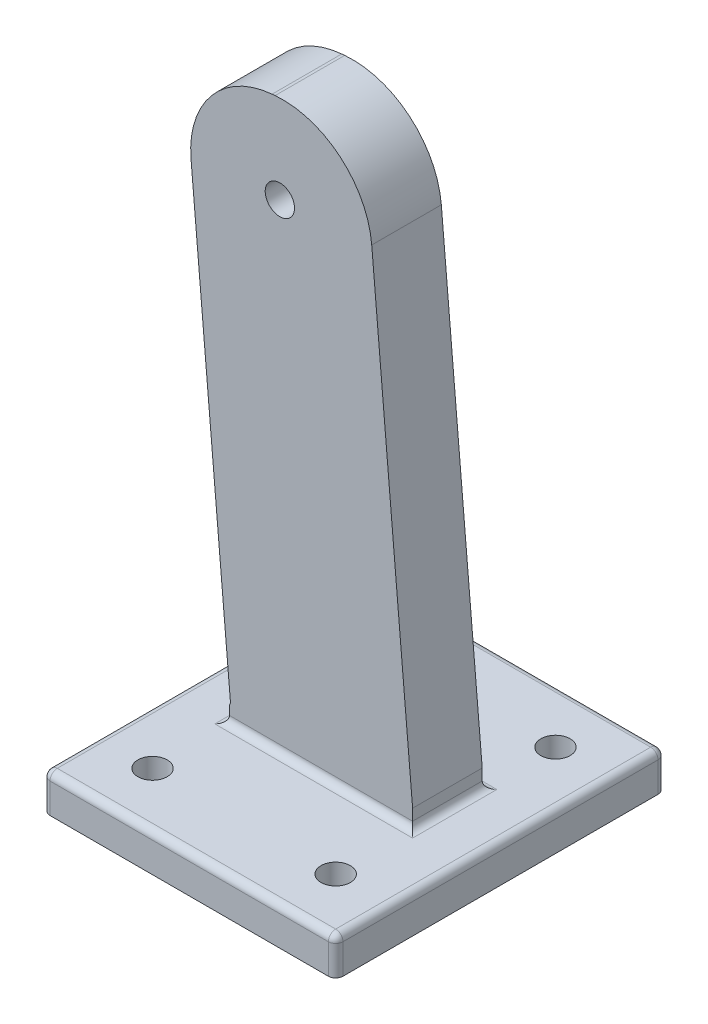
ISO-10303-21;
HEADER;
FILE_DESCRIPTION(('STEP AP214'),'2;1');
FILE_NAME('part.step','',(''),(''),'','','');
FILE_SCHEMA(('AUTOMOTIVE_DESIGN { 1 0 10303 214 1 1 1 1 }'));
ENDSEC;
DATA;
#1=APPLICATION_CONTEXT('core data for automotive mechanical design processes');
#2=APPLICATION_PROTOCOL_DEFINITION('international standard','automotive_design',2000,#1);
#3=PRODUCT_CONTEXT('',#1,'mechanical');
#4=PRODUCT('Part','Part','',(#3));
#5=PRODUCT_RELATED_PRODUCT_CATEGORY('part','',(#4));
#6=PRODUCT_DEFINITION_FORMATION('','',#4);
#7=PRODUCT_DEFINITION_CONTEXT('part definition',#1,'design');
#8=PRODUCT_DEFINITION('design','',#6,#7);
#9=PRODUCT_DEFINITION_SHAPE('','',#8);
#10=(LENGTH_UNIT() NAMED_UNIT(*) SI_UNIT(.MILLI.,.METRE.));
#11=(NAMED_UNIT(*) PLANE_ANGLE_UNIT() SI_UNIT($,.RADIAN.));
#12=(NAMED_UNIT(*) SI_UNIT($,.STERADIAN.) SOLID_ANGLE_UNIT());
#13=UNCERTAINTY_MEASURE_WITH_UNIT(LENGTH_MEASURE(1.E-05),#10,'distance_accuracy_value','');
#14=(GEOMETRIC_REPRESENTATION_CONTEXT(3) GLOBAL_UNCERTAINTY_ASSIGNED_CONTEXT((#13)) GLOBAL_UNIT_ASSIGNED_CONTEXT((#10,
#11,#12)) REPRESENTATION_CONTEXT('',''));
#15=CARTESIAN_POINT('',(0.,0.,0.));
#16=DIRECTION('',(0.,0.,1.));
#17=DIRECTION('',(1.,0.,0.));
#18=AXIS2_PLACEMENT_3D('',#15,#16,#17);
#19=CARTESIAN_POINT('',(0.,5.08,0.));
#20=DIRECTION('',(0.,-1.,0.));
#21=DIRECTION('',(0.,0.,-1.));
#22=AXIS2_PLACEMENT_3D('',#19,#20,#21);
#23=PLANE('',#22);
#24=DIRECTION('',(0.,0.,-1.));
#25=VECTOR('',#24,1.);
#26=CARTESIAN_POINT('',(33.5,5.08,-18.));
#27=LINE('',#26,#25);
#28=CARTESIAN_POINT('',(33.5,5.08,-28.5));
#29=VERTEX_POINT('',#28);
#30=CARTESIAN_POINT('',(33.5,5.08,-17.));
#31=VERTEX_POINT('',#30);
#32=EDGE_CURVE('E60',#29,#31,#27,.F.);
#33=ORIENTED_EDGE('',*,*,#32,.T.);
#34=DIRECTION('',(1.,0.,0.));
#35=VECTOR('',#34,1.);
#36=CARTESIAN_POINT('',(7.5,5.08,-17.));
#37=LINE('',#36,#35);
#38=CARTESIAN_POINT('',(6.5,5.08,-17.));
#39=VERTEX_POINT('',#38);
#40=EDGE_CURVE('E44',#31,#39,#37,.F.);
#41=ORIENTED_EDGE('',*,*,#40,.T.);
#42=DIRECTION('',(0.,0.,1.));
#43=VECTOR('',#42,1.);
#44=CARTESIAN_POINT('',(6.5,5.08,-27.5));
#45=LINE('',#44,#43);
#46=CARTESIAN_POINT('',(6.5,5.08,-28.5));
#47=VERTEX_POINT('',#46);
#48=EDGE_CURVE('E373',#39,#47,#45,.F.);
#49=ORIENTED_EDGE('',*,*,#48,.T.);
#50=DIRECTION('',(-1.,0.,0.));
#51=VECTOR('',#50,1.);
#52=CARTESIAN_POINT('',(32.5,5.08,-28.5));
#53=LINE('',#52,#51);
#54=EDGE_CURVE('E370',#47,#29,#53,.F.);
#55=ORIENTED_EDGE('',*,*,#54,.T.);
#56=EDGE_LOOP('',(#33,#41,#49,#55));
#57=FACE_BOUND('',#56,.T.);
#58=DIRECTION('',(0.,0.,1.));
#59=VECTOR('',#58,1.);
#60=CARTESIAN_POINT('',(1.,5.08,0.));
#61=LINE('',#60,#59);
#62=CARTESIAN_POINT('',(1.,5.08,-44.));
#63=VERTEX_POINT('',#62);
#64=CARTESIAN_POINT('',(1.,5.08,-1.));
#65=VERTEX_POINT('',#64);
#66=EDGE_CURVE('E313',#63,#65,#61,.T.);
#67=ORIENTED_EDGE('',*,*,#66,.T.);
#68=DIRECTION('',(1.,0.,0.));
#69=VECTOR('',#68,1.);
#70=CARTESIAN_POINT('',(0.,5.08,-1.));
#71=LINE('',#70,#69);
#72=CARTESIAN_POINT('',(39.,5.08,-1.));
#73=VERTEX_POINT('',#72);
#74=EDGE_CURVE('E315',#65,#73,#71,.T.);
#75=ORIENTED_EDGE('',*,*,#74,.T.);
#76=DIRECTION('',(0.,0.,-1.));
#77=VECTOR('',#76,1.);
#78=CARTESIAN_POINT('',(39.,5.08,0.));
#79=LINE('',#78,#77);
#80=CARTESIAN_POINT('',(39.,5.08,-44.));
#81=VERTEX_POINT('',#80);
#82=EDGE_CURVE('E309',#73,#81,#79,.T.);
#83=ORIENTED_EDGE('',*,*,#82,.T.);
#84=DIRECTION('',(-1.,0.,0.));
#85=VECTOR('',#84,1.);
#86=CARTESIAN_POINT('',(0.,5.08,-44.));
#87=LINE('',#86,#85);
#88=EDGE_CURVE('E311',#81,#63,#87,.T.);
#89=ORIENTED_EDGE('',*,*,#88,.T.);
#90=EDGE_LOOP('',(#67,#75,#83,#89));
#91=FACE_BOUND('',#90,.T.);
#92=CARTESIAN_POINT('',(32.5,5.08,-7.5));
#93=DIRECTION('',(0.,1.,0.));
#94=DIRECTION('',(0.,0.,1.));
#95=AXIS2_PLACEMENT_3D('',#92,#93,#94);
#96=CIRCLE('',#95,2.);
#97=CARTESIAN_POINT('',(32.5,5.08,-5.5));
#98=VERTEX_POINT('',#97);
#99=EDGE_CURVE('E231',#98,#98,#96,.T.);
#100=ORIENTED_EDGE('',*,*,#99,.F.);
#101=EDGE_LOOP('',(#100));
#102=FACE_BOUND('',#101,.T.);
#103=CARTESIAN_POINT('',(7.5,5.08,-7.50000000000001));
#104=DIRECTION('',(0.,1.,0.));
#105=DIRECTION('',(0.,0.,1.));
#106=AXIS2_PLACEMENT_3D('',#103,#104,#105);
#107=CIRCLE('',#106,2.);
#108=CARTESIAN_POINT('',(7.5,5.08,-5.50000000000001));
#109=VERTEX_POINT('',#108);
#110=EDGE_CURVE('E237',#109,#109,#107,.T.);
#111=ORIENTED_EDGE('',*,*,#110,.F.);
#112=EDGE_LOOP('',(#111));
#113=FACE_BOUND('',#112,.T.);
#114=CARTESIAN_POINT('',(32.5,5.08,-37.5));
#115=DIRECTION('',(0.,1.,0.));
#116=DIRECTION('',(0.,0.,1.));
#117=AXIS2_PLACEMENT_3D('',#114,#115,#116);
#118=CIRCLE('',#117,2.);
#119=CARTESIAN_POINT('',(32.5,5.08,-35.5));
#120=VERTEX_POINT('',#119);
#121=EDGE_CURVE('E243',#120,#120,#118,.T.);
#122=ORIENTED_EDGE('',*,*,#121,.F.);
#123=EDGE_LOOP('',(#122));
#124=FACE_BOUND('',#123,.T.);
#125=CARTESIAN_POINT('',(7.5,5.08,-37.5));
#126=DIRECTION('',(0.,1.,0.));
#127=DIRECTION('',(0.,0.,1.));
#128=AXIS2_PLACEMENT_3D('',#125,#126,#127);
#129=CIRCLE('',#128,2.);
#130=CARTESIAN_POINT('',(7.5,5.08,-35.5));
#131=VERTEX_POINT('',#130);
#132=EDGE_CURVE('E249',#131,#131,#129,.T.);
#133=ORIENTED_EDGE('',*,*,#132,.F.);
#134=EDGE_LOOP('',(#133));
#135=FACE_BOUND('',#134,.T.);
#136=ADVANCED_FACE('F35',(#57,#91,#102,#113,#124,#135),#23,.F.);
#137=CARTESIAN_POINT('',(0.,0.,0.));
#138=DIRECTION('',(0.,-1.,0.));
#139=DIRECTION('',(0.,0.,-1.));
#140=AXIS2_PLACEMENT_3D('',#137,#138,#139);
#141=PLANE('',#140);
#142=CARTESIAN_POINT('',(7.5,0.,-7.50000000000001));
#143=DIRECTION('',(0.,1.,0.));
#144=DIRECTION('',(0.,0.,1.));
#145=AXIS2_PLACEMENT_3D('',#142,#143,#144);
#146=CIRCLE('',#145,2.);
#147=CARTESIAN_POINT('',(7.5,0.,-5.50000000000001));
#148=VERTEX_POINT('',#147);
#149=EDGE_CURVE('E234',#148,#148,#146,.T.);
#150=ORIENTED_EDGE('',*,*,#149,.T.);
#151=EDGE_LOOP('',(#150));
#152=FACE_BOUND('',#151,.T.);
#153=CARTESIAN_POINT('',(7.5,0.,-37.5));
#154=DIRECTION('',(0.,1.,0.));
#155=DIRECTION('',(0.,0.,1.));
#156=AXIS2_PLACEMENT_3D('',#153,#154,#155);
#157=CIRCLE('',#156,2.);
#158=CARTESIAN_POINT('',(7.5,0.,-35.5));
#159=VERTEX_POINT('',#158);
#160=EDGE_CURVE('E246',#159,#159,#157,.T.);
#161=ORIENTED_EDGE('',*,*,#160,.T.);
#162=EDGE_LOOP('',(#161));
#163=FACE_BOUND('',#162,.T.);
#164=DIRECTION('',(1.,0.,0.));
#165=VECTOR('',#164,1.);
#166=CARTESIAN_POINT('',(0.,0.,0.));
#167=LINE('',#166,#165);
#168=CARTESIAN_POINT('',(1.,0.,0.));
#169=VERTEX_POINT('',#168);
#170=CARTESIAN_POINT('',(39.,0.,0.));
#171=VERTEX_POINT('',#170);
#172=EDGE_CURVE('E257',#169,#171,#167,.T.);
#173=ORIENTED_EDGE('',*,*,#172,.F.);
#174=CARTESIAN_POINT('',(1.,0.,-1.));
#175=DIRECTION('',(0.,-1.,0.));
#176=DIRECTION('',(0.,0.,-1.));
#177=AXIS2_PLACEMENT_3D('',#174,#175,#176);
#178=CIRCLE('',#177,1.);
#179=CARTESIAN_POINT('',(0.,0.,-1.));
#180=VERTEX_POINT('',#179);
#181=EDGE_CURVE('E295',#169,#180,#178,.T.);
#182=ORIENTED_EDGE('',*,*,#181,.T.);
#183=DIRECTION('',(0.,0.,1.));
#184=VECTOR('',#183,1.);
#185=CARTESIAN_POINT('',(0.,0.,0.));
#186=LINE('',#185,#184);
#187=CARTESIAN_POINT('',(0.,0.,-44.));
#188=VERTEX_POINT('',#187);
#189=EDGE_CURVE('E252',#188,#180,#186,.T.);
#190=ORIENTED_EDGE('',*,*,#189,.F.);
#191=CARTESIAN_POINT('',(1.,0.,-44.));
#192=DIRECTION('',(0.,-1.,0.));
#193=DIRECTION('',(0.,0.,-1.));
#194=AXIS2_PLACEMENT_3D('',#191,#192,#193);
#195=CIRCLE('',#194,1.);
#196=CARTESIAN_POINT('',(1.,0.,-45.));
#197=VERTEX_POINT('',#196);
#198=EDGE_CURVE('E291',#188,#197,#195,.T.);
#199=ORIENTED_EDGE('',*,*,#198,.T.);
#200=DIRECTION('',(-1.,0.,0.));
#201=VECTOR('',#200,1.);
#202=CARTESIAN_POINT('',(0.,0.,-45.));
#203=LINE('',#202,#201);
#204=CARTESIAN_POINT('',(39.,0.,-45.));
#205=VERTEX_POINT('',#204);
#206=EDGE_CURVE('E263',#205,#197,#203,.T.);
#207=ORIENTED_EDGE('',*,*,#206,.F.);
#208=CARTESIAN_POINT('',(39.,0.,-44.));
#209=DIRECTION('',(0.,-1.,0.));
#210=DIRECTION('',(0.,0.,-1.));
#211=AXIS2_PLACEMENT_3D('',#208,#209,#210);
#212=CIRCLE('',#211,1.);
#213=CARTESIAN_POINT('',(40.,0.,-44.));
#214=VERTEX_POINT('',#213);
#215=EDGE_CURVE('E289',#205,#214,#212,.T.);
#216=ORIENTED_EDGE('',*,*,#215,.T.);
#217=DIRECTION('',(0.,0.,-1.));
#218=VECTOR('',#217,1.);
#219=CARTESIAN_POINT('',(40.,0.,0.));
#220=LINE('',#219,#218);
#221=CARTESIAN_POINT('',(40.,0.,-1.));
#222=VERTEX_POINT('',#221);
#223=EDGE_CURVE('E260',#222,#214,#220,.T.);
#224=ORIENTED_EDGE('',*,*,#223,.F.);
#225=CARTESIAN_POINT('',(39.,0.,-1.));
#226=DIRECTION('',(0.,-1.,0.));
#227=DIRECTION('',(0.,0.,-1.));
#228=AXIS2_PLACEMENT_3D('',#225,#226,#227);
#229=CIRCLE('',#228,1.);
#230=EDGE_CURVE('E293',#222,#171,#229,.T.);
#231=ORIENTED_EDGE('',*,*,#230,.T.);
#232=EDGE_LOOP('',(#173,#182,#190,#199,#207,#216,#224,#231));
#233=FACE_BOUND('',#232,.T.);
#234=CARTESIAN_POINT('',(32.5,0.,-37.5));
#235=DIRECTION('',(0.,1.,0.));
#236=DIRECTION('',(0.,0.,1.));
#237=AXIS2_PLACEMENT_3D('',#234,#235,#236);
#238=CIRCLE('',#237,2.);
#239=CARTESIAN_POINT('',(32.5,0.,-35.5));
#240=VERTEX_POINT('',#239);
#241=EDGE_CURVE('E240',#240,#240,#238,.T.);
#242=ORIENTED_EDGE('',*,*,#241,.T.);
#243=EDGE_LOOP('',(#242));
#244=FACE_BOUND('',#243,.T.);
#245=CARTESIAN_POINT('',(32.5,0.,-7.5));
#246=DIRECTION('',(0.,1.,0.));
#247=DIRECTION('',(0.,0.,1.));
#248=AXIS2_PLACEMENT_3D('',#245,#246,#247);
#249=CIRCLE('',#248,2.);
#250=CARTESIAN_POINT('',(32.5,0.,-5.5));
#251=VERTEX_POINT('',#250);
#252=EDGE_CURVE('E230',#251,#251,#249,.T.);
#253=ORIENTED_EDGE('',*,*,#252,.T.);
#254=EDGE_LOOP('',(#253));
#255=FACE_BOUND('',#254,.T.);
#256=ADVANCED_FACE('F421',(#152,#163,#233,#244,#255),#141,.T.);
#257=CARTESIAN_POINT('',(0.,5.08,0.));
#258=DIRECTION('',(1.,0.,0.));
#259=DIRECTION('',(0.,0.,-1.));
#260=AXIS2_PLACEMENT_3D('',#257,#258,#259);
#261=PLANE('',#260);
#262=ORIENTED_EDGE('',*,*,#189,.T.);
#263=DIRECTION('',(0.,-1.,0.));
#264=VECTOR('',#263,1.);
#265=CARTESIAN_POINT('',(0.,5.08,-1.));
#266=LINE('',#265,#264);
#267=CARTESIAN_POINT('',(0.,4.08,-1.));
#268=VERTEX_POINT('',#267);
#269=EDGE_CURVE('E301',#180,#268,#266,.F.);
#270=ORIENTED_EDGE('',*,*,#269,.T.);
#271=DIRECTION('',(0.,0.,1.));
#272=VECTOR('',#271,1.);
#273=CARTESIAN_POINT('',(0.,4.08,0.));
#274=LINE('',#273,#272);
#275=CARTESIAN_POINT('',(0.,4.08,-44.));
#276=VERTEX_POINT('',#275);
#277=EDGE_CURVE('E299',#268,#276,#274,.F.);
#278=ORIENTED_EDGE('',*,*,#277,.T.);
#279=DIRECTION('',(0.,-1.,0.));
#280=VECTOR('',#279,1.);
#281=CARTESIAN_POINT('',(0.,5.08,-44.));
#282=LINE('',#281,#280);
#283=EDGE_CURVE('E297',#276,#188,#282,.T.);
#284=ORIENTED_EDGE('',*,*,#283,.T.);
#285=EDGE_LOOP('',(#262,#270,#278,#284));
#286=FACE_BOUND('',#285,.T.);
#287=ADVANCED_FACE('F426',(#286),#261,.F.);
#288=CARTESIAN_POINT('',(0.,5.08,0.));
#289=DIRECTION('',(0.,0.,-1.));
#290=DIRECTION('',(-1.,0.,0.));
#291=AXIS2_PLACEMENT_3D('',#288,#289,#290);
#292=PLANE('',#291);
#293=DIRECTION('',(1.,0.,0.));
#294=VECTOR('',#293,1.);
#295=CARTESIAN_POINT('',(0.,4.08,0.));
#296=LINE('',#295,#294);
#297=CARTESIAN_POINT('',(39.,4.08,0.));
#298=VERTEX_POINT('',#297);
#299=CARTESIAN_POINT('',(1.,4.08,0.));
#300=VERTEX_POINT('',#299);
#301=EDGE_CURVE('E282',#298,#300,#296,.F.);
#302=ORIENTED_EDGE('',*,*,#301,.T.);
#303=DIRECTION('',(0.,-1.,0.));
#304=VECTOR('',#303,1.);
#305=CARTESIAN_POINT('',(1.,5.08,0.));
#306=LINE('',#305,#304);
#307=EDGE_CURVE('E286',#300,#169,#306,.T.);
#308=ORIENTED_EDGE('',*,*,#307,.T.);
#309=ORIENTED_EDGE('',*,*,#172,.T.);
#310=DIRECTION('',(0.,-1.,0.));
#311=VECTOR('',#310,1.);
#312=CARTESIAN_POINT('',(39.,5.08,0.));
#313=LINE('',#312,#311);
#314=EDGE_CURVE('E284',#171,#298,#313,.F.);
#315=ORIENTED_EDGE('',*,*,#314,.T.);
#316=EDGE_LOOP('',(#302,#308,#309,#315));
#317=FACE_BOUND('',#316,.T.);
#318=ADVANCED_FACE('F440',(#317),#292,.F.);
#319=CARTESIAN_POINT('',(40.,5.08,0.));
#320=DIRECTION('',(-1.,0.,0.));
#321=DIRECTION('',(0.,0.,1.));
#322=AXIS2_PLACEMENT_3D('',#319,#320,#321);
#323=PLANE('',#322);
#324=DIRECTION('',(0.,0.,-1.));
#325=VECTOR('',#324,1.);
#326=CARTESIAN_POINT('',(40.,4.08,0.));
#327=LINE('',#326,#325);
#328=CARTESIAN_POINT('',(40.,4.08,-44.));
#329=VERTEX_POINT('',#328);
#330=CARTESIAN_POINT('',(40.,4.08,-1.));
#331=VERTEX_POINT('',#330);
#332=EDGE_CURVE('E305',#329,#331,#327,.F.);
#333=ORIENTED_EDGE('',*,*,#332,.T.);
#334=DIRECTION('',(0.,-1.,0.));
#335=VECTOR('',#334,1.);
#336=CARTESIAN_POINT('',(40.,5.08,-1.));
#337=LINE('',#336,#335);
#338=EDGE_CURVE('E307',#331,#222,#337,.T.);
#339=ORIENTED_EDGE('',*,*,#338,.T.);
#340=ORIENTED_EDGE('',*,*,#223,.T.);
#341=DIRECTION('',(0.,-1.,0.));
#342=VECTOR('',#341,1.);
#343=CARTESIAN_POINT('',(40.,5.08,-44.));
#344=LINE('',#343,#342);
#345=EDGE_CURVE('E303',#214,#329,#344,.F.);
#346=ORIENTED_EDGE('',*,*,#345,.T.);
#347=EDGE_LOOP('',(#333,#339,#340,#346));
#348=FACE_BOUND('',#347,.T.);
#349=ADVANCED_FACE('F436',(#348),#323,.F.);
#350=CARTESIAN_POINT('',(0.,5.08,-45.));
#351=DIRECTION('',(0.,0.,1.));
#352=DIRECTION('',(1.,0.,0.));
#353=AXIS2_PLACEMENT_3D('',#350,#351,#352);
#354=PLANE('',#353);
#355=ORIENTED_EDGE('',*,*,#206,.T.);
#356=DIRECTION('',(0.,-1.,0.));
#357=VECTOR('',#356,1.);
#358=CARTESIAN_POINT('',(1.,5.08,-45.));
#359=LINE('',#358,#357);
#360=CARTESIAN_POINT('',(1.,4.08,-45.));
#361=VERTEX_POINT('',#360);
#362=EDGE_CURVE('E322',#197,#361,#359,.F.);
#363=ORIENTED_EDGE('',*,*,#362,.T.);
#364=DIRECTION('',(-1.,0.,0.));
#365=VECTOR('',#364,1.);
#366=CARTESIAN_POINT('',(0.,4.08,-45.));
#367=LINE('',#366,#365);
#368=CARTESIAN_POINT('',(39.,4.08,-45.));
#369=VERTEX_POINT('',#368);
#370=EDGE_CURVE('E320',#361,#369,#367,.F.);
#371=ORIENTED_EDGE('',*,*,#370,.T.);
#372=DIRECTION('',(0.,-1.,0.));
#373=VECTOR('',#372,1.);
#374=CARTESIAN_POINT('',(39.,5.08,-45.));
#375=LINE('',#374,#373);
#376=EDGE_CURVE('E318',#369,#205,#375,.T.);
#377=ORIENTED_EDGE('',*,*,#376,.T.);
#378=EDGE_LOOP('',(#355,#363,#371,#377));
#379=FACE_BOUND('',#378,.T.);
#380=ADVANCED_FACE('F433',(#379),#354,.F.);
#381=CARTESIAN_POINT('',(7.5,5.08,-37.5));
#382=DIRECTION('',(0.,-1.,0.));
#383=DIRECTION('',(0.,0.,-1.));
#384=AXIS2_PLACEMENT_3D('',#381,#382,#383);
#385=CYLINDRICAL_SURFACE('',#384,2.);
#386=ORIENTED_EDGE('',*,*,#132,.T.);
#387=EDGE_LOOP('',(#386));
#388=FACE_BOUND('',#387,.T.);
#389=ORIENTED_EDGE('',*,*,#160,.F.);
#390=EDGE_LOOP('',(#389));
#391=FACE_BOUND('',#390,.T.);
#392=ADVANCED_FACE('F430',(#388,#391),#385,.F.);
#393=CARTESIAN_POINT('',(32.5,5.08,-37.5));
#394=DIRECTION('',(0.,-1.,0.));
#395=DIRECTION('',(0.,0.,-1.));
#396=AXIS2_PLACEMENT_3D('',#393,#394,#395);
#397=CYLINDRICAL_SURFACE('',#396,2.);
#398=ORIENTED_EDGE('',*,*,#121,.T.);
#399=EDGE_LOOP('',(#398));
#400=FACE_BOUND('',#399,.T.);
#401=ORIENTED_EDGE('',*,*,#241,.F.);
#402=EDGE_LOOP('',(#401));
#403=FACE_BOUND('',#402,.T.);
#404=ADVANCED_FACE('F653',(#400,#403),#397,.F.);
#405=CARTESIAN_POINT('',(7.5,5.08,-7.50000000000001));
#406=DIRECTION('',(0.,-1.,0.));
#407=DIRECTION('',(0.,0.,-1.));
#408=AXIS2_PLACEMENT_3D('',#405,#406,#407);
#409=CYLINDRICAL_SURFACE('',#408,2.);
#410=ORIENTED_EDGE('',*,*,#110,.T.);
#411=EDGE_LOOP('',(#410));
#412=FACE_BOUND('',#411,.T.);
#413=ORIENTED_EDGE('',*,*,#149,.F.);
#414=EDGE_LOOP('',(#413));
#415=FACE_BOUND('',#414,.T.);
#416=ADVANCED_FACE('F644',(#412,#415),#409,.F.);
#417=CARTESIAN_POINT('',(32.5,5.08,-7.5));
#418=DIRECTION('',(0.,-1.,0.));
#419=DIRECTION('',(0.,0.,-1.));
#420=AXIS2_PLACEMENT_3D('',#417,#418,#419);
#421=CYLINDRICAL_SURFACE('',#420,2.);
#422=ORIENTED_EDGE('',*,*,#99,.T.);
#423=EDGE_LOOP('',(#422));
#424=FACE_BOUND('',#423,.T.);
#425=ORIENTED_EDGE('',*,*,#252,.F.);
#426=EDGE_LOOP('',(#425));
#427=FACE_BOUND('',#426,.T.);
#428=ADVANCED_FACE('F417',(#424,#427),#421,.F.);
#429=CARTESIAN_POINT('',(7.5,7.62,-27.5));
#430=DIRECTION('',(1.,0.,0.));
#431=DIRECTION('',(0.,0.,-1.));
#432=AXIS2_PLACEMENT_3D('',#429,#430,#431);
#433=PLANE('',#432);
#434=DIRECTION('',(0.,-1.,0.));
#435=VECTOR('',#434,1.);
#436=CARTESIAN_POINT('',(7.5,7.62,-18.));
#437=LINE('',#436,#435);
#438=CARTESIAN_POINT('',(7.5,7.10253235380205,-18.));
#439=VERTEX_POINT('',#438);
#440=CARTESIAN_POINT('',(7.5,6.08,-18.));
#441=VERTEX_POINT('',#440);
#442=EDGE_CURVE('E203',#439,#441,#437,.T.);
#443=ORIENTED_EDGE('',*,*,#442,.F.);
#444=DIRECTION('',(0.,0.,1.));
#445=VECTOR('',#444,1.);
#446=CARTESIAN_POINT('',(7.5,7.10253235380205,-27.5));
#447=LINE('',#446,#445);
#448=CARTESIAN_POINT('',(7.5,7.10253235380205,-27.5));
#449=VERTEX_POINT('',#448);
#450=EDGE_CURVE('E364',#439,#449,#447,.F.);
#451=ORIENTED_EDGE('',*,*,#450,.T.);
#452=DIRECTION('',(0.,-1.,0.));
#453=VECTOR('',#452,1.);
#454=CARTESIAN_POINT('',(7.5,7.62,-27.5));
#455=LINE('',#454,#453);
#456=CARTESIAN_POINT('',(7.5,6.08,-27.5));
#457=VERTEX_POINT('',#456);
#458=EDGE_CURVE('E191',#449,#457,#455,.T.);
#459=ORIENTED_EDGE('',*,*,#458,.T.);
#460=DIRECTION('',(0.,0.,1.));
#461=VECTOR('',#460,1.);
#462=CARTESIAN_POINT('',(7.5,6.08,-18.));
#463=LINE('',#462,#461);
#464=EDGE_CURVE('E362',#457,#441,#463,.T.);
#465=ORIENTED_EDGE('',*,*,#464,.T.);
#466=EDGE_LOOP('',(#443,#451,#459,#465));
#467=FACE_BOUND('',#466,.T.);
#468=ADVANCED_FACE('F410',(#467),#433,.F.);
#469=CARTESIAN_POINT('',(7.5,7.62,-18.));
#470=DIRECTION('',(0.,0.,-1.));
#471=DIRECTION('',(-1.,0.,0.));
#472=AXIS2_PLACEMENT_3D('',#469,#470,#471);
#473=PLANE('',#472);
#474=DIRECTION('',(0.0871557427476618,-0.996194698091745,0.));
#475=VECTOR('',#474,1.);
#476=CARTESIAN_POINT('',(7.6442972273398,7.61999999999999,-18.));
#477=LINE('',#476,#475);
#478=CARTESIAN_POINT('',(2.25295778570946,69.2432917997723,-18.));
#479=VERTEX_POINT('',#478);
#480=CARTESIAN_POINT('',(7.6442972273398,7.62,-18.));
#481=VERTEX_POINT('',#480);
#482=EDGE_CURVE('E213',#479,#481,#477,.T.);
#483=ORIENTED_EDGE('',*,*,#482,.T.);
#484=CARTESIAN_POINT('',(8.5,7.10253235380205,-18.));
#485=DIRECTION('',(0.,0.,-1.));
#486=DIRECTION('',(-1.,0.,0.));
#487=AXIS2_PLACEMENT_3D('',#484,#485,#486);
#488=CIRCLE('',#487,1.);
#489=EDGE_CURVE('E360',#481,#439,#488,.F.);
#490=ORIENTED_EDGE('',*,*,#489,.T.);
#491=ORIENTED_EDGE('',*,*,#442,.T.);
#492=DIRECTION('',(1.,0.,0.));
#493=VECTOR('',#492,1.);
#494=CARTESIAN_POINT('',(32.5,6.08,-18.));
#495=LINE('',#494,#493);
#496=CARTESIAN_POINT('',(32.5,6.08,-18.));
#497=VERTEX_POINT('',#496);
#498=EDGE_CURVE('E202',#441,#497,#495,.T.);
#499=ORIENTED_EDGE('',*,*,#498,.T.);
#500=DIRECTION('',(0.,-1.,0.));
#501=VECTOR('',#500,1.);
#502=CARTESIAN_POINT('',(32.5,7.62,-18.));
#503=LINE('',#502,#501);
#504=CARTESIAN_POINT('',(32.5,7.62,-18.));
#505=VERTEX_POINT('',#504);
#506=EDGE_CURVE('E184',#505,#497,#503,.T.);
#507=ORIENTED_EDGE('',*,*,#506,.F.);
#508=DIRECTION('',(-0.087155742747663,0.996194698091745,0.));
#509=VECTOR('',#508,1.);
#510=CARTESIAN_POINT('',(32.5,7.62,-18.));
#511=LINE('',#510,#509);
#512=CARTESIAN_POINT('',(26.9198535705809,71.401365545324,-18.));
#513=VERTEX_POINT('',#512);
#514=EDGE_CURVE('E200',#505,#513,#511,.T.);
#515=ORIENTED_EDGE('',*,*,#514,.T.);
#516=CARTESIAN_POINT('',(14.7911831213139,70.3402443773712,-18.));
#517=DIRECTION('',(0.,0.,-1.));
#518=DIRECTION('',(-1.,0.,0.));
#519=AXIS2_PLACEMENT_3D('',#516,#517,#518);
#520=CIRCLE('',#519,12.175);
#521=CARTESIAN_POINT('',(13.7300619533611,82.4689148266383,-18.));
#522=VERTEX_POINT('',#521);
#523=EDGE_CURVE('E269',#513,#522,#520,.F.);
#524=ORIENTED_EDGE('',*,*,#523,.T.);
#525=DIRECTION('',(-0.996194698091746,-0.0871557427476581,0.));
#526=VECTOR('',#525,1.);
#527=CARTESIAN_POINT('',(1.19183661775668,81.3719622490394,-18.));
#528=LINE('',#527,#526);
#529=CARTESIAN_POINT('',(13.3205070670237,82.4330834169921,-18.));
#530=VERTEX_POINT('',#529);
#531=EDGE_CURVE('E209',#522,#530,#528,.T.);
#532=ORIENTED_EDGE('',*,*,#531,.T.);
#533=CARTESIAN_POINT('',(14.3816282349765,70.3044129677251,-18.));
#534=DIRECTION('',(0.,0.,-1.));
#535=DIRECTION('',(-1.,0.,0.));
#536=AXIS2_PLACEMENT_3D('',#533,#534,#535);
#537=CIRCLE('',#536,12.175);
#538=EDGE_CURVE('E267',#530,#479,#537,.F.);
#539=ORIENTED_EDGE('',*,*,#538,.T.);
#540=EDGE_LOOP('',(#483,#490,#491,#499,#507,#515,#524,#532,#539));
#541=FACE_BOUND('',#540,.T.);
#542=CARTESIAN_POINT('',(14.3801525432217,70.4799523329958,-18.));
#543=DIRECTION('',(0.,0.,1.));
#544=DIRECTION('',(1.,0.,0.));
#545=AXIS2_PLACEMENT_3D('',#542,#543,#544);
#546=CIRCLE('',#545,2.);
#547=CARTESIAN_POINT('',(16.3801525432217,70.4799523329958,-18.));
#548=VERTEX_POINT('',#547);
#549=EDGE_CURVE('E216',#548,#548,#546,.T.);
#550=ORIENTED_EDGE('',*,*,#549,.F.);
#551=EDGE_LOOP('',(#550));
#552=FACE_BOUND('',#551,.T.);
#553=ADVANCED_FACE('F198',(#541,#552),#473,.F.);
#554=CARTESIAN_POINT('',(32.5,7.62,-27.5));
#555=DIRECTION('',(-1.,0.,0.));
#556=DIRECTION('',(0.,0.,1.));
#557=AXIS2_PLACEMENT_3D('',#554,#555,#556);
#558=PLANE('',#557);
#559=ORIENTED_EDGE('',*,*,#506,.T.);
#560=DIRECTION('',(0.,0.,-1.));
#561=VECTOR('',#560,1.);
#562=CARTESIAN_POINT('',(32.5,6.08,-27.5));
#563=LINE('',#562,#561);
#564=CARTESIAN_POINT('',(32.5,6.08,-27.5));
#565=VERTEX_POINT('',#564);
#566=EDGE_CURVE('E11',#497,#565,#563,.T.);
#567=ORIENTED_EDGE('',*,*,#566,.T.);
#568=DIRECTION('',(0.,-1.,0.));
#569=VECTOR('',#568,1.);
#570=CARTESIAN_POINT('',(32.5,7.62,-27.5));
#571=LINE('',#570,#569);
#572=CARTESIAN_POINT('',(32.5,7.62,-27.5));
#573=VERTEX_POINT('',#572);
#574=EDGE_CURVE('E186',#573,#565,#571,.T.);
#575=ORIENTED_EDGE('',*,*,#574,.F.);
#576=DIRECTION('',(0.,0.,-1.));
#577=VECTOR('',#576,1.);
#578=CARTESIAN_POINT('',(32.5,7.62,-27.5));
#579=LINE('',#578,#577);
#580=EDGE_CURVE('E181',#505,#573,#579,.T.);
#581=ORIENTED_EDGE('',*,*,#580,.F.);
#582=EDGE_LOOP('',(#559,#567,#575,#581));
#583=FACE_BOUND('',#582,.T.);
#584=ADVANCED_FACE('F183',(#583),#558,.F.);
#585=CARTESIAN_POINT('',(7.5,7.62,-27.5));
#586=DIRECTION('',(0.,0.,1.));
#587=DIRECTION('',(1.,0.,0.));
#588=AXIS2_PLACEMENT_3D('',#585,#586,#587);
#589=PLANE('',#588);
#590=ORIENTED_EDGE('',*,*,#458,.F.);
#591=CARTESIAN_POINT('',(8.5,7.10253235380205,-27.5));
#592=DIRECTION('',(0.,0.,1.));
#593=DIRECTION('',(1.,0.,0.));
#594=AXIS2_PLACEMENT_3D('',#591,#592,#593);
#595=CIRCLE('',#594,1.);
#596=CARTESIAN_POINT('',(7.6442972273398,7.62,-27.5));
#597=VERTEX_POINT('',#596);
#598=EDGE_CURVE('E368',#449,#597,#595,.F.);
#599=ORIENTED_EDGE('',*,*,#598,.T.);
#600=DIRECTION('',(0.0871557427476618,-0.996194698091745,0.));
#601=VECTOR('',#600,1.);
#602=CARTESIAN_POINT('',(7.6442972273398,7.61999999999999,-27.5));
#603=LINE('',#602,#601);
#604=CARTESIAN_POINT('',(2.25295778570946,69.2432917997723,-27.5));
#605=VERTEX_POINT('',#604);
#606=EDGE_CURVE('E219',#605,#597,#603,.T.);
#607=ORIENTED_EDGE('',*,*,#606,.F.);
#608=CARTESIAN_POINT('',(14.3816282349765,70.3044129677251,-27.5));
#609=DIRECTION('',(0.,0.,1.));
#610=DIRECTION('',(1.,0.,0.));
#611=AXIS2_PLACEMENT_3D('',#608,#609,#610);
#612=CIRCLE('',#611,12.175);
#613=CARTESIAN_POINT('',(13.3205070670237,82.4330834169921,-27.5));
#614=VERTEX_POINT('',#613);
#615=EDGE_CURVE('E276',#605,#614,#612,.F.);
#616=ORIENTED_EDGE('',*,*,#615,.T.);
#617=DIRECTION('',(-0.996194698091746,-0.0871557427476581,0.));
#618=VECTOR('',#617,1.);
#619=CARTESIAN_POINT('',(1.19183661775668,81.3719622490394,-27.5));
#620=LINE('',#619,#618);
#621=CARTESIAN_POINT('',(13.7300619533611,82.4689148266383,-27.5));
#622=VERTEX_POINT('',#621);
#623=EDGE_CURVE('E401',#622,#614,#620,.T.);
#624=ORIENTED_EDGE('',*,*,#623,.F.);
#625=CARTESIAN_POINT('',(14.7911831213139,70.3402443773712,-27.5));
#626=DIRECTION('',(0.,0.,1.));
#627=DIRECTION('',(1.,0.,0.));
#628=AXIS2_PLACEMENT_3D('',#625,#626,#627);
#629=CIRCLE('',#628,12.175);
#630=CARTESIAN_POINT('',(26.9198535705809,71.401365545324,-27.5));
#631=VERTEX_POINT('',#630);
#632=EDGE_CURVE('E278',#622,#631,#629,.F.);
#633=ORIENTED_EDGE('',*,*,#632,.T.);
#634=DIRECTION('',(-0.087155742747663,0.996194698091745,0.));
#635=VECTOR('',#634,1.);
#636=CARTESIAN_POINT('',(32.5,7.62,-27.5));
#637=LINE('',#636,#635);
#638=EDGE_CURVE('E223',#573,#631,#637,.T.);
#639=ORIENTED_EDGE('',*,*,#638,.F.);
#640=ORIENTED_EDGE('',*,*,#574,.T.);
#641=DIRECTION('',(-1.,0.,0.));
#642=VECTOR('',#641,1.);
#643=CARTESIAN_POINT('',(7.5,6.08,-27.5));
#644=LINE('',#643,#642);
#645=EDGE_CURVE('E366',#565,#457,#644,.T.);
#646=ORIENTED_EDGE('',*,*,#645,.T.);
#647=EDGE_LOOP('',(#590,#599,#607,#616,#624,#633,#639,#640,#646));
#648=FACE_BOUND('',#647,.T.);
#649=CARTESIAN_POINT('',(14.3801525432217,70.4799523329958,-27.5));
#650=DIRECTION('',(0.,0.,1.));
#651=DIRECTION('',(1.,0.,0.));
#652=AXIS2_PLACEMENT_3D('',#649,#650,#651);
#653=CIRCLE('',#652,2.);
#654=CARTESIAN_POINT('',(16.3801525432217,70.4799523329958,-27.5));
#655=VERTEX_POINT('',#654);
#656=EDGE_CURVE('E210',#655,#655,#653,.T.);
#657=ORIENTED_EDGE('',*,*,#656,.T.);
#658=EDGE_LOOP('',(#657));
#659=FACE_BOUND('',#658,.T.);
#660=ADVANCED_FACE('F397',(#648,#659),#589,.F.);
#661=CARTESIAN_POINT('',(7.6442972273398,7.61999999999999,-27.5));
#662=DIRECTION('',(-0.996194698091745,-0.0871557427476618,0.));
#663=DIRECTION('',(0.0871557427476618,-0.996194698091745,0.));
#664=AXIS2_PLACEMENT_3D('',#661,#662,#663);
#665=PLANE('',#664);
#666=ORIENTED_EDGE('',*,*,#482,.F.);
#667=DIRECTION('',(0.,0.,1.));
#668=VECTOR('',#667,1.);
#669=CARTESIAN_POINT('',(2.25295778570946,69.2432917997723,-27.5));
#670=LINE('',#669,#668);
#671=EDGE_CURVE('E280',#479,#605,#670,.F.);
#672=ORIENTED_EDGE('',*,*,#671,.T.);
#673=ORIENTED_EDGE('',*,*,#606,.T.);
#674=DIRECTION('',(0.,0.,1.));
#675=VECTOR('',#674,1.);
#676=CARTESIAN_POINT('',(7.6442972273398,7.61999999999999,-27.5));
#677=LINE('',#676,#675);
#678=EDGE_CURVE('E192',#597,#481,#677,.T.);
#679=ORIENTED_EDGE('',*,*,#678,.T.);
#680=EDGE_LOOP('',(#666,#672,#673,#679));
#681=FACE_BOUND('',#680,.T.);
#682=ADVANCED_FACE('F601',(#681),#665,.T.);
#683=CARTESIAN_POINT('',(1.19183661775668,81.3719622490394,-27.5));
#684=DIRECTION('',(-0.0871557427476581,0.996194698091746,0.));
#685=DIRECTION('',(-0.996194698091746,-0.0871557427476581,0.));
#686=AXIS2_PLACEMENT_3D('',#683,#684,#685);
#687=PLANE('',#686);
#688=ORIENTED_EDGE('',*,*,#531,.F.);
#689=DIRECTION('',(0.,0.,1.));
#690=VECTOR('',#689,1.);
#691=CARTESIAN_POINT('',(13.7300619533611,82.4689148266383,-27.5));
#692=LINE('',#691,#690);
#693=EDGE_CURVE('E274',#522,#622,#692,.F.);
#694=ORIENTED_EDGE('',*,*,#693,.T.);
#695=ORIENTED_EDGE('',*,*,#623,.T.);
#696=DIRECTION('',(0.,0.,1.));
#697=VECTOR('',#696,1.);
#698=CARTESIAN_POINT('',(13.3205070670237,82.4330834169921,-27.5));
#699=LINE('',#698,#697);
#700=EDGE_CURVE('E271',#614,#530,#699,.T.);
#701=ORIENTED_EDGE('',*,*,#700,.T.);
#702=EDGE_LOOP('',(#688,#694,#695,#701));
#703=FACE_BOUND('',#702,.T.);
#704=ADVANCED_FACE('F595',(#703),#687,.T.);
#705=CARTESIAN_POINT('',(32.5,7.62,-27.5));
#706=DIRECTION('',(0.996194698091745,0.087155742747663,0.));
#707=DIRECTION('',(-0.087155742747663,0.996194698091745,0.));
#708=AXIS2_PLACEMENT_3D('',#705,#706,#707);
#709=PLANE('',#708);
#710=ORIENTED_EDGE('',*,*,#638,.T.);
#711=DIRECTION('',(0.,0.,1.));
#712=VECTOR('',#711,1.);
#713=CARTESIAN_POINT('',(26.9198535705809,71.401365545324,-27.5));
#714=LINE('',#713,#712);
#715=EDGE_CURVE('E208',#631,#513,#714,.T.);
#716=ORIENTED_EDGE('',*,*,#715,.T.);
#717=ORIENTED_EDGE('',*,*,#514,.F.);
#718=ORIENTED_EDGE('',*,*,#580,.T.);
#719=EDGE_LOOP('',(#710,#716,#717,#718));
#720=FACE_BOUND('',#719,.T.);
#721=ADVANCED_FACE('F206',(#720),#709,.T.);
#722=CARTESIAN_POINT('',(14.3801525432217,70.4799523329958,-27.5));
#723=DIRECTION('',(0.,0.,1.));
#724=DIRECTION('',(1.,0.,0.));
#725=AXIS2_PLACEMENT_3D('',#722,#723,#724);
#726=CYLINDRICAL_SURFACE('',#725,2.);
#727=ORIENTED_EDGE('',*,*,#656,.F.);
#728=EDGE_LOOP('',(#727));
#729=FACE_BOUND('',#728,.T.);
#730=ORIENTED_EDGE('',*,*,#549,.T.);
#731=EDGE_LOOP('',(#730));
#732=FACE_BOUND('',#731,.T.);
#733=ADVANCED_FACE('F408',(#729,#732),#726,.F.);
#734=CARTESIAN_POINT('',(14.7911831213139,70.3402443773712,-27.5));
#735=DIRECTION('',(0.,0.,1.));
#736=DIRECTION('',(1.,0.,0.));
#737=AXIS2_PLACEMENT_3D('',#734,#735,#736);
#738=CYLINDRICAL_SURFACE('',#737,12.175);
#739=ORIENTED_EDGE('',*,*,#632,.F.);
#740=ORIENTED_EDGE('',*,*,#693,.F.);
#741=ORIENTED_EDGE('',*,*,#523,.F.);
#742=ORIENTED_EDGE('',*,*,#715,.F.);
#743=EDGE_LOOP('',(#739,#740,#741,#742));
#744=FACE_BOUND('',#743,.T.);
#745=ADVANCED_FACE('F448',(#744),#738,.T.);
#746=CARTESIAN_POINT('',(14.3816282349765,70.3044129677251,-27.5));
#747=DIRECTION('',(0.,0.,1.));
#748=DIRECTION('',(1.,0.,0.));
#749=AXIS2_PLACEMENT_3D('',#746,#747,#748);
#750=CYLINDRICAL_SURFACE('',#749,12.175);
#751=ORIENTED_EDGE('',*,*,#615,.F.);
#752=ORIENTED_EDGE('',*,*,#671,.F.);
#753=ORIENTED_EDGE('',*,*,#538,.F.);
#754=ORIENTED_EDGE('',*,*,#700,.F.);
#755=EDGE_LOOP('',(#751,#752,#753,#754));
#756=FACE_BOUND('',#755,.T.);
#757=ADVANCED_FACE('F451',(#756),#750,.T.);
#758=CARTESIAN_POINT('',(39.,5.08,-44.));
#759=DIRECTION('',(0.,-1.,0.));
#760=DIRECTION('',(0.,0.,-1.));
#761=AXIS2_PLACEMENT_3D('',#758,#759,#760);
#762=CYLINDRICAL_SURFACE('',#761,1.);
#763=CARTESIAN_POINT('',(39.,4.08,-44.));
#764=DIRECTION('',(0.,1.,0.));
#765=DIRECTION('',(0.,0.,1.));
#766=AXIS2_PLACEMENT_3D('',#763,#764,#765);
#767=CIRCLE('',#766,1.);
#768=EDGE_CURVE('E356',#329,#369,#767,.T.);
#769=ORIENTED_EDGE('',*,*,#768,.F.);
#770=ORIENTED_EDGE('',*,*,#345,.F.);
#771=ORIENTED_EDGE('',*,*,#215,.F.);
#772=ORIENTED_EDGE('',*,*,#376,.F.);
#773=EDGE_LOOP('',(#769,#770,#771,#772));
#774=FACE_BOUND('',#773,.T.);
#775=ADVANCED_FACE('F455',(#774),#762,.T.);
#776=CARTESIAN_POINT('',(39.,4.08,-44.));
#777=DIRECTION('',(0.,0.,1.));
#778=DIRECTION('',(1.,0.,0.));
#779=AXIS2_PLACEMENT_3D('',#776,#777,#778);
#780=SPHERICAL_SURFACE('',#779,1.);
#781=CARTESIAN_POINT('',(39.,4.08,-44.));
#782=DIRECTION('',(0.,0.,-1.));
#783=DIRECTION('',(-1.,0.,0.));
#784=AXIS2_PLACEMENT_3D('',#781,#782,#783);
#785=CIRCLE('',#784,1.);
#786=EDGE_CURVE('E350',#329,#81,#785,.F.);
#787=ORIENTED_EDGE('',*,*,#786,.F.);
#788=ORIENTED_EDGE('',*,*,#768,.T.);
#789=CARTESIAN_POINT('',(39.,4.08,-44.));
#790=DIRECTION('',(1.,0.,0.));
#791=DIRECTION('',(0.,0.,-1.));
#792=AXIS2_PLACEMENT_3D('',#789,#790,#791);
#793=CIRCLE('',#792,1.);
#794=EDGE_CURVE('E353',#81,#369,#793,.F.);
#795=ORIENTED_EDGE('',*,*,#794,.F.);
#796=EDGE_LOOP('',(#787,#788,#795));
#797=FACE_BOUND('',#796,.T.);
#798=ADVANCED_FACE('F497',(#797),#780,.T.);
#799=CARTESIAN_POINT('',(1.,5.08,-44.));
#800=DIRECTION('',(0.,-1.,0.));
#801=DIRECTION('',(0.,0.,-1.));
#802=AXIS2_PLACEMENT_3D('',#799,#800,#801);
#803=CYLINDRICAL_SURFACE('',#802,1.);
#804=ORIENTED_EDGE('',*,*,#198,.F.);
#805=ORIENTED_EDGE('',*,*,#283,.F.);
#806=CARTESIAN_POINT('',(1.,4.08,-44.));
#807=DIRECTION('',(0.,1.,0.));
#808=DIRECTION('',(0.,0.,1.));
#809=AXIS2_PLACEMENT_3D('',#806,#807,#808);
#810=CIRCLE('',#809,1.);
#811=EDGE_CURVE('E347',#361,#276,#810,.T.);
#812=ORIENTED_EDGE('',*,*,#811,.F.);
#813=ORIENTED_EDGE('',*,*,#362,.F.);
#814=EDGE_LOOP('',(#804,#805,#812,#813));
#815=FACE_BOUND('',#814,.T.);
#816=ADVANCED_FACE('F493',(#815),#803,.T.);
#817=CARTESIAN_POINT('',(0.,4.08,-44.));
#818=DIRECTION('',(-1.,0.,0.));
#819=DIRECTION('',(0.,0.,1.));
#820=AXIS2_PLACEMENT_3D('',#817,#818,#819);
#821=CYLINDRICAL_SURFACE('',#820,1.);
#822=ORIENTED_EDGE('',*,*,#794,.T.);
#823=ORIENTED_EDGE('',*,*,#370,.F.);
#824=CARTESIAN_POINT('',(1.,4.08,-44.));
#825=DIRECTION('',(-1.,0.,0.));
#826=DIRECTION('',(0.,0.,1.));
#827=AXIS2_PLACEMENT_3D('',#824,#825,#826);
#828=CIRCLE('',#827,1.);
#829=EDGE_CURVE('E344',#63,#361,#828,.T.);
#830=ORIENTED_EDGE('',*,*,#829,.F.);
#831=ORIENTED_EDGE('',*,*,#88,.F.);
#832=EDGE_LOOP('',(#822,#823,#830,#831));
#833=FACE_BOUND('',#832,.T.);
#834=ADVANCED_FACE('F489',(#833),#821,.T.);
#835=CARTESIAN_POINT('',(39.,4.08,0.));
#836=DIRECTION('',(0.,0.,-1.));
#837=DIRECTION('',(-1.,0.,0.));
#838=AXIS2_PLACEMENT_3D('',#835,#836,#837);
#839=CYLINDRICAL_SURFACE('',#838,1.);
#840=ORIENTED_EDGE('',*,*,#786,.T.);
#841=ORIENTED_EDGE('',*,*,#82,.F.);
#842=CARTESIAN_POINT('',(39.,4.08,-1.));
#843=DIRECTION('',(0.,0.,1.));
#844=DIRECTION('',(1.,0.,0.));
#845=AXIS2_PLACEMENT_3D('',#842,#843,#844);
#846=CIRCLE('',#845,1.);
#847=EDGE_CURVE('E341',#331,#73,#846,.T.);
#848=ORIENTED_EDGE('',*,*,#847,.F.);
#849=ORIENTED_EDGE('',*,*,#332,.F.);
#850=EDGE_LOOP('',(#840,#841,#848,#849));
#851=FACE_BOUND('',#850,.T.);
#852=ADVANCED_FACE('F485',(#851),#839,.T.);
#853=CARTESIAN_POINT('',(39.,5.08,-1.));
#854=DIRECTION('',(0.,-1.,0.));
#855=DIRECTION('',(0.,0.,-1.));
#856=AXIS2_PLACEMENT_3D('',#853,#854,#855);
#857=CYLINDRICAL_SURFACE('',#856,1.);
#858=ORIENTED_EDGE('',*,*,#230,.F.);
#859=ORIENTED_EDGE('',*,*,#338,.F.);
#860=CARTESIAN_POINT('',(39.,4.08,-1.));
#861=DIRECTION('',(0.,1.,0.));
#862=DIRECTION('',(0.,0.,1.));
#863=AXIS2_PLACEMENT_3D('',#860,#861,#862);
#864=CIRCLE('',#863,1.);
#865=EDGE_CURVE('E338',#298,#331,#864,.T.);
#866=ORIENTED_EDGE('',*,*,#865,.F.);
#867=ORIENTED_EDGE('',*,*,#314,.F.);
#868=EDGE_LOOP('',(#858,#859,#866,#867));
#869=FACE_BOUND('',#868,.T.);
#870=ADVANCED_FACE('F481',(#869),#857,.T.);
#871=CARTESIAN_POINT('',(1.,4.08,-44.));
#872=DIRECTION('',(0.,0.,1.));
#873=DIRECTION('',(1.,0.,0.));
#874=AXIS2_PLACEMENT_3D('',#871,#872,#873);
#875=SPHERICAL_SURFACE('',#874,1.);
#876=ORIENTED_EDGE('',*,*,#829,.T.);
#877=ORIENTED_EDGE('',*,*,#811,.T.);
#878=CARTESIAN_POINT('',(1.,4.08,-44.));
#879=DIRECTION('',(0.,0.,-1.));
#880=DIRECTION('',(-1.,0.,0.));
#881=AXIS2_PLACEMENT_3D('',#878,#879,#880);
#882=CIRCLE('',#881,1.);
#883=EDGE_CURVE('E335',#63,#276,#882,.F.);
#884=ORIENTED_EDGE('',*,*,#883,.F.);
#885=EDGE_LOOP('',(#876,#877,#884));
#886=FACE_BOUND('',#885,.T.);
#887=ADVANCED_FACE('F477',(#886),#875,.T.);
#888=CARTESIAN_POINT('',(39.,4.08,-1.));
#889=DIRECTION('',(0.,0.,1.));
#890=DIRECTION('',(1.,0.,0.));
#891=AXIS2_PLACEMENT_3D('',#888,#889,#890);
#892=SPHERICAL_SURFACE('',#891,1.);
#893=ORIENTED_EDGE('',*,*,#865,.T.);
#894=ORIENTED_EDGE('',*,*,#847,.T.);
#895=CARTESIAN_POINT('',(39.,4.08,-1.));
#896=DIRECTION('',(1.,0.,0.));
#897=DIRECTION('',(0.,0.,-1.));
#898=AXIS2_PLACEMENT_3D('',#895,#896,#897);
#899=CIRCLE('',#898,1.);
#900=EDGE_CURVE('E333',#298,#73,#899,.F.);
#901=ORIENTED_EDGE('',*,*,#900,.F.);
#902=EDGE_LOOP('',(#893,#894,#901));
#903=FACE_BOUND('',#902,.T.);
#904=ADVANCED_FACE('F473',(#903),#892,.T.);
#905=CARTESIAN_POINT('',(1.,4.08,0.));
#906=DIRECTION('',(0.,0.,1.));
#907=DIRECTION('',(1.,0.,0.));
#908=AXIS2_PLACEMENT_3D('',#905,#906,#907);
#909=CYLINDRICAL_SURFACE('',#908,1.);
#910=ORIENTED_EDGE('',*,*,#883,.T.);
#911=ORIENTED_EDGE('',*,*,#277,.F.);
#912=CARTESIAN_POINT('',(1.,4.08,-1.));
#913=DIRECTION('',(0.,0.,1.));
#914=DIRECTION('',(1.,0.,0.));
#915=AXIS2_PLACEMENT_3D('',#912,#913,#914);
#916=CIRCLE('',#915,1.);
#917=EDGE_CURVE('E330',#65,#268,#916,.T.);
#918=ORIENTED_EDGE('',*,*,#917,.F.);
#919=ORIENTED_EDGE('',*,*,#66,.F.);
#920=EDGE_LOOP('',(#910,#911,#918,#919));
#921=FACE_BOUND('',#920,.T.);
#922=ADVANCED_FACE('F469',(#921),#909,.T.);
#923=CARTESIAN_POINT('',(0.,4.08,-1.));
#924=DIRECTION('',(1.,0.,0.));
#925=DIRECTION('',(0.,0.,-1.));
#926=AXIS2_PLACEMENT_3D('',#923,#924,#925);
#927=CYLINDRICAL_SURFACE('',#926,1.);
#928=ORIENTED_EDGE('',*,*,#900,.T.);
#929=ORIENTED_EDGE('',*,*,#74,.F.);
#930=CARTESIAN_POINT('',(1.,4.08,-1.));
#931=DIRECTION('',(-1.,0.,0.));
#932=DIRECTION('',(0.,0.,1.));
#933=AXIS2_PLACEMENT_3D('',#930,#931,#932);
#934=CIRCLE('',#933,1.);
#935=EDGE_CURVE('E327',#300,#65,#934,.T.);
#936=ORIENTED_EDGE('',*,*,#935,.F.);
#937=ORIENTED_EDGE('',*,*,#301,.F.);
#938=EDGE_LOOP('',(#928,#929,#936,#937));
#939=FACE_BOUND('',#938,.T.);
#940=ADVANCED_FACE('F465',(#939),#927,.T.);
#941=CARTESIAN_POINT('',(1.,4.08,-1.));
#942=DIRECTION('',(0.,0.,1.));
#943=DIRECTION('',(1.,0.,0.));
#944=AXIS2_PLACEMENT_3D('',#941,#942,#943);
#945=SPHERICAL_SURFACE('',#944,1.);
#946=ORIENTED_EDGE('',*,*,#935,.T.);
#947=ORIENTED_EDGE('',*,*,#917,.T.);
#948=CARTESIAN_POINT('',(1.,4.08,-1.));
#949=DIRECTION('',(0.,1.,0.));
#950=DIRECTION('',(0.,0.,1.));
#951=AXIS2_PLACEMENT_3D('',#948,#949,#950);
#952=CIRCLE('',#951,1.);
#953=EDGE_CURVE('E324',#300,#268,#952,.F.);
#954=ORIENTED_EDGE('',*,*,#953,.F.);
#955=EDGE_LOOP('',(#946,#947,#954));
#956=FACE_BOUND('',#955,.T.);
#957=ADVANCED_FACE('F461',(#956),#945,.T.);
#958=CARTESIAN_POINT('',(1.,5.08,-1.));
#959=DIRECTION('',(0.,-1.,0.));
#960=DIRECTION('',(0.,0.,-1.));
#961=AXIS2_PLACEMENT_3D('',#958,#959,#960);
#962=CYLINDRICAL_SURFACE('',#961,1.);
#963=ORIENTED_EDGE('',*,*,#953,.T.);
#964=ORIENTED_EDGE('',*,*,#269,.F.);
#965=ORIENTED_EDGE('',*,*,#181,.F.);
#966=ORIENTED_EDGE('',*,*,#307,.F.);
#967=EDGE_LOOP('',(#963,#964,#965,#966));
#968=FACE_BOUND('',#967,.T.);
#969=ADVANCED_FACE('F457',(#968),#962,.T.);
#970=CARTESIAN_POINT('',(8.5,7.10253235380205,0.));
#971=DIRECTION('',(0.,0.,1.));
#972=DIRECTION('',(1.,0.,0.));
#973=AXIS2_PLACEMENT_3D('',#970,#971,#972);
#974=CYLINDRICAL_SURFACE('',#973,1.);
#975=ORIENTED_EDGE('',*,*,#598,.F.);
#976=ORIENTED_EDGE('',*,*,#450,.F.);
#977=ORIENTED_EDGE('',*,*,#489,.F.);
#978=ORIENTED_EDGE('',*,*,#678,.F.);
#979=EDGE_LOOP('',(#975,#976,#977,#978));
#980=FACE_BOUND('',#979,.T.);
#981=ADVANCED_FACE('F460',(#980),#974,.T.);
#982=CARTESIAN_POINT('',(7.5,6.08,-28.5));
#983=DIRECTION('',(1.,0.,0.));
#984=DIRECTION('',(0.,0.,-1.));
#985=AXIS2_PLACEMENT_3D('',#982,#983,#984);
#986=CYLINDRICAL_SURFACE('',#985,1.);
#987=CARTESIAN_POINT('',(33.5,6.08,-28.5));
#988=DIRECTION('',(0.707106781186548,0.,0.707106781186547));
#989=DIRECTION('',(0.707106781186547,0.,-0.707106781186548));
#990=AXIS2_PLACEMENT_3D('',#987,#988,#989);
#991=ELLIPSE('',#990,1.41421356237309,1.);
#992=EDGE_CURVE('E378',#29,#565,#991,.F.);
#993=ORIENTED_EDGE('',*,*,#992,.F.);
#994=ORIENTED_EDGE('',*,*,#54,.F.);
#995=CARTESIAN_POINT('',(6.5,6.08,-28.5));
#996=DIRECTION('',(0.707106781186547,0.,-0.707106781186548));
#997=DIRECTION('',(0.707106781186547,0.,0.707106781186547));
#998=AXIS2_PLACEMENT_3D('',#995,#996,#997);
#999=ELLIPSE('',#998,1.4142135623731,1.);
#1000=EDGE_CURVE('E39',#457,#47,#999,.T.);
#1001=ORIENTED_EDGE('',*,*,#1000,.F.);
#1002=ORIENTED_EDGE('',*,*,#645,.F.);
#1003=EDGE_LOOP('',(#993,#994,#1001,#1002));
#1004=FACE_BOUND('',#1003,.T.);
#1005=ADVANCED_FACE('F37',(#1004),#986,.F.);
#1006=CARTESIAN_POINT('',(6.5,6.08,-27.5));
#1007=DIRECTION('',(0.,0.,-1.));
#1008=DIRECTION('',(-1.,0.,0.));
#1009=AXIS2_PLACEMENT_3D('',#1006,#1007,#1008);
#1010=CYLINDRICAL_SURFACE('',#1009,1.);
#1011=ORIENTED_EDGE('',*,*,#1000,.T.);
#1012=ORIENTED_EDGE('',*,*,#48,.F.);
#1013=CARTESIAN_POINT('',(6.5,6.08,-17.));
#1014=DIRECTION('',(-0.707106781186547,0.,-0.707106781186547));
#1015=DIRECTION('',(0.707106781186547,0.,-0.707106781186548));
#1016=AXIS2_PLACEMENT_3D('',#1013,#1014,#1015);
#1017=ELLIPSE('',#1016,1.41421356237309,1.);
#1018=EDGE_CURVE('E52',#441,#39,#1017,.T.);
#1019=ORIENTED_EDGE('',*,*,#1018,.F.);
#1020=ORIENTED_EDGE('',*,*,#464,.F.);
#1021=EDGE_LOOP('',(#1011,#1012,#1019,#1020));
#1022=FACE_BOUND('',#1021,.T.);
#1023=ADVANCED_FACE('F387',(#1022),#1010,.F.);
#1024=CARTESIAN_POINT('',(33.5,6.08,-27.5));
#1025=DIRECTION('',(0.,0.,1.));
#1026=DIRECTION('',(1.,0.,0.));
#1027=AXIS2_PLACEMENT_3D('',#1024,#1025,#1026);
#1028=CYLINDRICAL_SURFACE('',#1027,1.);
#1029=ORIENTED_EDGE('',*,*,#992,.T.);
#1030=ORIENTED_EDGE('',*,*,#566,.F.);
#1031=CARTESIAN_POINT('',(33.5,6.08,-17.));
#1032=DIRECTION('',(-0.707106781186547,0.,0.707106781186548));
#1033=DIRECTION('',(0.707106781186548,0.,0.707106781186547));
#1034=AXIS2_PLACEMENT_3D('',#1031,#1032,#1033);
#1035=ELLIPSE('',#1034,1.4142135623731,1.);
#1036=EDGE_CURVE('E376',#31,#497,#1035,.F.);
#1037=ORIENTED_EDGE('',*,*,#1036,.F.);
#1038=ORIENTED_EDGE('',*,*,#32,.F.);
#1039=EDGE_LOOP('',(#1029,#1030,#1037,#1038));
#1040=FACE_BOUND('',#1039,.T.);
#1041=ADVANCED_FACE('F394',(#1040),#1028,.F.);
#1042=CARTESIAN_POINT('',(7.5,6.08,-17.));
#1043=DIRECTION('',(-1.,0.,0.));
#1044=DIRECTION('',(0.,0.,1.));
#1045=AXIS2_PLACEMENT_3D('',#1042,#1043,#1044);
#1046=CYLINDRICAL_SURFACE('',#1045,1.);
#1047=ORIENTED_EDGE('',*,*,#1018,.T.);
#1048=ORIENTED_EDGE('',*,*,#40,.F.);
#1049=ORIENTED_EDGE('',*,*,#1036,.T.);
#1050=ORIENTED_EDGE('',*,*,#498,.F.);
#1051=EDGE_LOOP('',(#1047,#1048,#1049,#1050));
#1052=FACE_BOUND('',#1051,.T.);
#1053=ADVANCED_FACE('F393',(#1052),#1046,.F.);
#1054=CLOSED_SHELL('',(#136,#256,#287,#318,#349,#380,#392,#404,#416,#428,#468,#553,#584,#660,
#682,#704,#721,#733,#745,#757,#775,#798,#816,#834,#852,#870,#887,#904,#922,#940,#957,#969,#981,
#1005,#1023,#1041,#1053));
#1055=MANIFOLD_SOLID_BREP('B2',#1054);
#1056=ADVANCED_BREP_SHAPE_REPRESENTATION('',(#18,#1055),#14);
#1057=SHAPE_DEFINITION_REPRESENTATION(#9,#1056);
ENDSEC;
END-ISO-10303-21;
